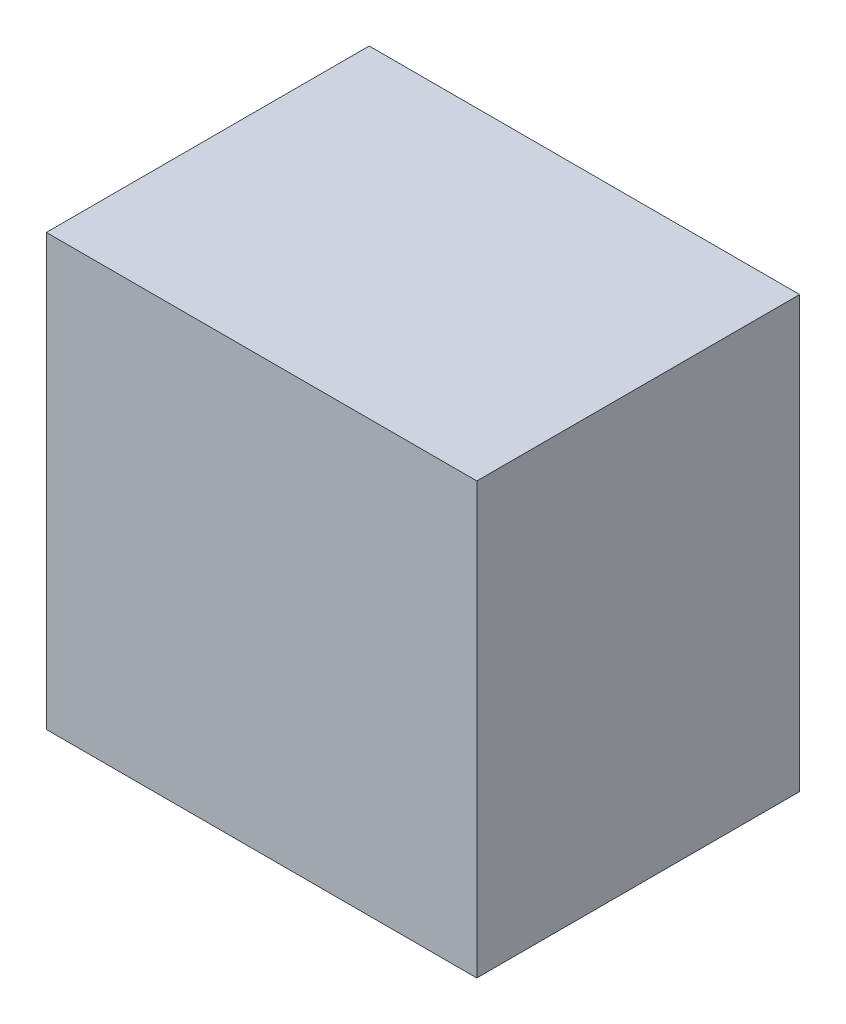
ISO-10303-21;
HEADER;
FILE_DESCRIPTION(('STEP AP214'),'2;1');
FILE_NAME('part.step','',(''),(''),'','','');
FILE_SCHEMA(('AUTOMOTIVE_DESIGN { 1 0 10303 214 1 1 1 1 }'));
ENDSEC;
DATA;
#1=APPLICATION_CONTEXT('core data for automotive mechanical design processes');
#2=APPLICATION_PROTOCOL_DEFINITION('international standard','automotive_design',2000,#1);
#3=PRODUCT_CONTEXT('',#1,'mechanical');
#4=PRODUCT('Part','Part','',(#3));
#5=PRODUCT_RELATED_PRODUCT_CATEGORY('part','',(#4));
#6=PRODUCT_DEFINITION_FORMATION('','',#4);
#7=PRODUCT_DEFINITION_CONTEXT('part definition',#1,'design');
#8=PRODUCT_DEFINITION('design','',#6,#7);
#9=PRODUCT_DEFINITION_SHAPE('','',#8);
#10=(LENGTH_UNIT() NAMED_UNIT(*) SI_UNIT(.MILLI.,.METRE.));
#11=(NAMED_UNIT(*) PLANE_ANGLE_UNIT() SI_UNIT($,.RADIAN.));
#12=(NAMED_UNIT(*) SI_UNIT($,.STERADIAN.) SOLID_ANGLE_UNIT());
#13=UNCERTAINTY_MEASURE_WITH_UNIT(LENGTH_MEASURE(1.E-05),#10,'distance_accuracy_value','');
#14=(GEOMETRIC_REPRESENTATION_CONTEXT(3) GLOBAL_UNCERTAINTY_ASSIGNED_CONTEXT((#13)) GLOBAL_UNIT_ASSIGNED_CONTEXT((#10,
#11,#12)) REPRESENTATION_CONTEXT('',''));
#15=CARTESIAN_POINT('',(0.,0.,0.));
#16=DIRECTION('',(0.,0.,1.));
#17=DIRECTION('',(1.,0.,0.));
#18=AXIS2_PLACEMENT_3D('',#15,#16,#17);
#19=CARTESIAN_POINT('',(2.45,0.,0.33));
#20=DIRECTION('',(0.,0.,1.));
#21=DIRECTION('',(1.,0.,0.));
#22=AXIS2_PLACEMENT_3D('',#19,#20,#21);
#23=PLANE('',#22);
#24=DIRECTION('',(0.,1.,0.));
#25=VECTOR('',#24,1.);
#26=CARTESIAN_POINT('',(2.45,0.,0.33));
#27=LINE('',#26,#25);
#28=CARTESIAN_POINT('',(2.45,0.,0.33));
#29=VERTEX_POINT('',#28);
#30=CARTESIAN_POINT('',(2.45,-0.2,0.33));
#31=VERTEX_POINT('',#30);
#32=EDGE_CURVE('E20',#29,#31,#27,.F.);
#33=ORIENTED_EDGE('',*,*,#32,.F.);
#34=DIRECTION('',(1.,0.,0.));
#35=VECTOR('',#34,1.);
#36=CARTESIAN_POINT('',(0.,0.,0.33));
#37=LINE('',#36,#35);
#38=CARTESIAN_POINT('',(2.25,0.,0.33));
#39=VERTEX_POINT('',#38);
#40=EDGE_CURVE('E80',#29,#39,#37,.F.);
#41=ORIENTED_EDGE('',*,*,#40,.T.);
#42=DIRECTION('',(0.,1.,0.));
#43=VECTOR('',#42,1.);
#44=CARTESIAN_POINT('',(2.25,0.,0.33));
#45=LINE('',#44,#43);
#46=CARTESIAN_POINT('',(2.25,-0.2,0.33));
#47=VERTEX_POINT('',#46);
#48=EDGE_CURVE('E61',#47,#39,#45,.T.);
#49=ORIENTED_EDGE('',*,*,#48,.F.);
#50=DIRECTION('',(1.,0.,0.));
#51=VECTOR('',#50,1.);
#52=CARTESIAN_POINT('',(0.,-0.2,0.33));
#53=LINE('',#52,#51);
#54=EDGE_CURVE('E56',#31,#47,#53,.F.);
#55=ORIENTED_EDGE('',*,*,#54,.F.);
#56=EDGE_LOOP('',(#33,#41,#49,#55));
#57=FACE_BOUND('',#56,.T.);
#58=ADVANCED_FACE('F17',(#57),#23,.T.);
#59=CARTESIAN_POINT('',(2.45,0.,0.18));
#60=DIRECTION('',(1.,0.,0.));
#61=DIRECTION('',(0.,0.,-1.));
#62=AXIS2_PLACEMENT_3D('',#59,#60,#61);
#63=PLANE('',#62);
#64=DIRECTION('',(0.,1.,0.));
#65=VECTOR('',#64,1.);
#66=CARTESIAN_POINT('',(2.45,0.,0.18));
#67=LINE('',#66,#65);
#68=CARTESIAN_POINT('',(2.45,0.,0.18));
#69=VERTEX_POINT('',#68);
#70=CARTESIAN_POINT('',(2.45,-0.2,0.18));
#71=VERTEX_POINT('',#70);
#72=EDGE_CURVE('E83',#69,#71,#67,.F.);
#73=ORIENTED_EDGE('',*,*,#72,.F.);
#74=DIRECTION('',(0.,0.,-1.));
#75=VECTOR('',#74,1.);
#76=CARTESIAN_POINT('',(2.45,0.,0.));
#77=LINE('',#76,#75);
#78=EDGE_CURVE('E68',#69,#29,#77,.F.);
#79=ORIENTED_EDGE('',*,*,#78,.T.);
#80=ORIENTED_EDGE('',*,*,#32,.T.);
#81=DIRECTION('',(0.,0.,-1.));
#82=VECTOR('',#81,1.);
#83=CARTESIAN_POINT('',(2.45,-0.2,0.));
#84=LINE('',#83,#82);
#85=EDGE_CURVE('E63',#71,#31,#84,.F.);
#86=ORIENTED_EDGE('',*,*,#85,.F.);
#87=EDGE_LOOP('',(#73,#79,#80,#86));
#88=FACE_BOUND('',#87,.T.);
#89=ADVANCED_FACE('F65',(#88),#63,.T.);
#90=CARTESIAN_POINT('',(0.,-0.2,0.));
#91=DIRECTION('',(0.,-1.,0.));
#92=DIRECTION('',(0.,0.,-1.));
#93=AXIS2_PLACEMENT_3D('',#90,#91,#92);
#94=PLANE('',#93);
#95=DIRECTION('',(-1.,0.,0.));
#96=VECTOR('',#95,1.);
#97=CARTESIAN_POINT('',(2.25,-0.2,0.18));
#98=LINE('',#97,#96);
#99=CARTESIAN_POINT('',(2.25,-0.2,0.18));
#100=VERTEX_POINT('',#99);
#101=EDGE_CURVE('E72',#71,#100,#98,.T.);
#102=ORIENTED_EDGE('',*,*,#101,.F.);
#103=ORIENTED_EDGE('',*,*,#85,.T.);
#104=ORIENTED_EDGE('',*,*,#54,.T.);
#105=DIRECTION('',(0.,0.,1.));
#106=VECTOR('',#105,1.);
#107=CARTESIAN_POINT('',(2.25,-0.2,0.33));
#108=LINE('',#107,#106);
#109=EDGE_CURVE('E74',#100,#47,#108,.T.);
#110=ORIENTED_EDGE('',*,*,#109,.F.);
#111=EDGE_LOOP('',(#102,#103,#104,#110));
#112=FACE_BOUND('',#111,.T.);
#113=ADVANCED_FACE('F70',(#112),#94,.T.);
#114=CARTESIAN_POINT('',(2.25,0.,0.33));
#115=DIRECTION('',(-1.,0.,0.));
#116=DIRECTION('',(0.,0.,1.));
#117=AXIS2_PLACEMENT_3D('',#114,#115,#116);
#118=PLANE('',#117);
#119=ORIENTED_EDGE('',*,*,#48,.T.);
#120=DIRECTION('',(0.,0.,-1.));
#121=VECTOR('',#120,1.);
#122=CARTESIAN_POINT('',(2.25,0.,0.));
#123=LINE('',#122,#121);
#124=CARTESIAN_POINT('',(2.25,0.,0.18));
#125=VERTEX_POINT('',#124);
#126=EDGE_CURVE('E35',#39,#125,#123,.T.);
#127=ORIENTED_EDGE('',*,*,#126,.T.);
#128=DIRECTION('',(0.,1.,0.));
#129=VECTOR('',#128,1.);
#130=CARTESIAN_POINT('',(2.25,0.,0.18));
#131=LINE('',#130,#129);
#132=EDGE_CURVE('E26',#100,#125,#131,.T.);
#133=ORIENTED_EDGE('',*,*,#132,.F.);
#134=ORIENTED_EDGE('',*,*,#109,.T.);
#135=EDGE_LOOP('',(#119,#127,#133,#134));
#136=FACE_BOUND('',#135,.T.);
#137=ADVANCED_FACE('F89',(#136),#118,.T.);
#138=CARTESIAN_POINT('',(0.,0.,0.));
#139=DIRECTION('',(0.,-1.,0.));
#140=DIRECTION('',(0.,0.,-1.));
#141=AXIS2_PLACEMENT_3D('',#138,#139,#140);
#142=PLANE('',#141);
#143=ORIENTED_EDGE('',*,*,#126,.F.);
#144=ORIENTED_EDGE('',*,*,#40,.F.);
#145=ORIENTED_EDGE('',*,*,#78,.F.);
#146=DIRECTION('',(-1.,0.,0.));
#147=VECTOR('',#146,1.);
#148=CARTESIAN_POINT('',(2.25,0.,0.18));
#149=LINE('',#148,#147);
#150=EDGE_CURVE('E11',#125,#69,#149,.F.);
#151=ORIENTED_EDGE('',*,*,#150,.F.);
#152=EDGE_LOOP('',(#143,#144,#145,#151));
#153=FACE_BOUND('',#152,.T.);
#154=ADVANCED_FACE('F91',(#153),#142,.F.);
#155=CARTESIAN_POINT('',(2.25,0.,0.18));
#156=DIRECTION('',(0.,0.,-1.));
#157=DIRECTION('',(-1.,0.,0.));
#158=AXIS2_PLACEMENT_3D('',#155,#156,#157);
#159=PLANE('',#158);
#160=ORIENTED_EDGE('',*,*,#132,.T.);
#161=ORIENTED_EDGE('',*,*,#150,.T.);
#162=ORIENTED_EDGE('',*,*,#72,.T.);
#163=ORIENTED_EDGE('',*,*,#101,.T.);
#164=EDGE_LOOP('',(#160,#161,#162,#163));
#165=FACE_BOUND('',#164,.T.);
#166=ADVANCED_FACE('F88',(#165),#159,.T.);
#167=CLOSED_SHELL('',(#58,#89,#113,#137,#154,#166));
#168=MANIFOLD_SOLID_BREP('B1',#167);
#169=ADVANCED_BREP_SHAPE_REPRESENTATION('',(#18,#168),#14);
#170=SHAPE_DEFINITION_REPRESENTATION(#9,#169);
ENDSEC;
END-ISO-10303-21;
